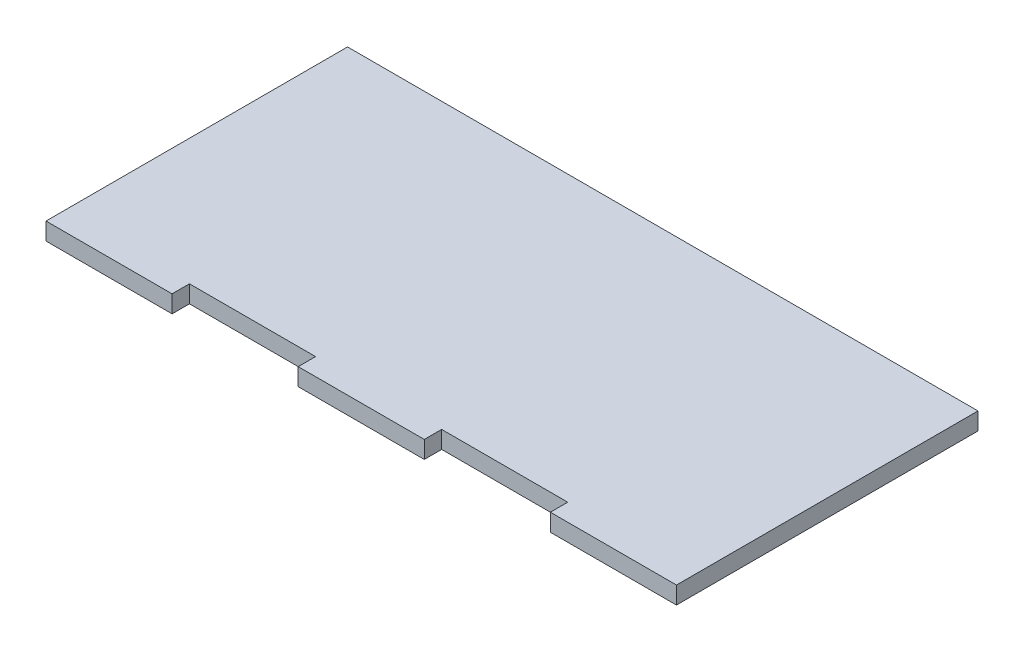
ISO-10303-21;
HEADER;
FILE_DESCRIPTION(('STEP AP214'),'2;1');
FILE_NAME('part.step','',(''),(''),'','','');
FILE_SCHEMA(('AUTOMOTIVE_DESIGN { 1 0 10303 214 1 1 1 1 }'));
ENDSEC;
DATA;
#1=APPLICATION_CONTEXT('core data for automotive mechanical design processes');
#2=APPLICATION_PROTOCOL_DEFINITION('international standard','automotive_design',2000,#1);
#3=PRODUCT_CONTEXT('',#1,'mechanical');
#4=PRODUCT('Part','Part','',(#3));
#5=PRODUCT_RELATED_PRODUCT_CATEGORY('part','',(#4));
#6=PRODUCT_DEFINITION_FORMATION('','',#4);
#7=PRODUCT_DEFINITION_CONTEXT('part definition',#1,'design');
#8=PRODUCT_DEFINITION('design','',#6,#7);
#9=PRODUCT_DEFINITION_SHAPE('','',#8);
#10=(LENGTH_UNIT() NAMED_UNIT(*) SI_UNIT(.MILLI.,.METRE.));
#11=(NAMED_UNIT(*) PLANE_ANGLE_UNIT() SI_UNIT($,.RADIAN.));
#12=(NAMED_UNIT(*) SI_UNIT($,.STERADIAN.) SOLID_ANGLE_UNIT());
#13=UNCERTAINTY_MEASURE_WITH_UNIT(LENGTH_MEASURE(1.E-05),#10,'distance_accuracy_value','');
#14=(GEOMETRIC_REPRESENTATION_CONTEXT(3) GLOBAL_UNCERTAINTY_ASSIGNED_CONTEXT((#13)) GLOBAL_UNIT_ASSIGNED_CONTEXT((#10,
#11,#12)) REPRESENTATION_CONTEXT('',''));
#15=CARTESIAN_POINT('',(0.,0.,0.));
#16=DIRECTION('',(0.,0.,1.));
#17=DIRECTION('',(1.,0.,0.));
#18=AXIS2_PLACEMENT_3D('',#15,#16,#17);
#19=CARTESIAN_POINT('',(-69.720993227991,9.7536,-3.44018058690745));
#20=DIRECTION('',(0.,0.,-1.));
#21=DIRECTION('',(-1.,0.,0.));
#22=AXIS2_PLACEMENT_3D('',#19,#20,#21);
#23=PLANE('',#22);
#24=DIRECTION('',(1.,0.,0.));
#25=VECTOR('',#24,1.);
#26=CARTESIAN_POINT('',(-69.720993227991,0.,-3.44018058690745));
#27=LINE('',#26,#25);
#28=CARTESIAN_POINT('',(-69.720993227991,0.,-3.44018058690745));
#29=VERTEX_POINT('',#28);
#30=CARTESIAN_POINT('',(1.07998277200905,0.,-3.44018058690745));
#31=VERTEX_POINT('',#30);
#32=EDGE_CURVE('E196',#29,#31,#27,.T.);
#33=ORIENTED_EDGE('',*,*,#32,.T.);
#34=DIRECTION('',(0.,-1.,0.));
#35=VECTOR('',#34,1.);
#36=CARTESIAN_POINT('',(1.07998277200905,9.7536,-3.44018058690745));
#37=LINE('',#36,#35);
#38=CARTESIAN_POINT('',(1.07998277200905,9.7536,-3.44018058690745));
#39=VERTEX_POINT('',#38);
#40=EDGE_CURVE('E152',#39,#31,#37,.T.);
#41=ORIENTED_EDGE('',*,*,#40,.F.);
#42=DIRECTION('',(1.,0.,0.));
#43=VECTOR('',#42,1.);
#44=CARTESIAN_POINT('',(-69.720993227991,9.7536,-3.44018058690745));
#45=LINE('',#44,#43);
#46=CARTESIAN_POINT('',(-69.720993227991,9.7536,-3.44018058690745));
#47=VERTEX_POINT('',#46);
#48=EDGE_CURVE('E142',#47,#39,#45,.T.);
#49=ORIENTED_EDGE('',*,*,#48,.F.);
#50=DIRECTION('',(0.,-1.,0.));
#51=VECTOR('',#50,1.);
#52=CARTESIAN_POINT('',(-69.720993227991,9.7536,-3.44018058690745));
#53=LINE('',#52,#51);
#54=EDGE_CURVE('E11',#47,#29,#53,.T.);
#55=ORIENTED_EDGE('',*,*,#54,.T.);
#56=EDGE_LOOP('',(#33,#41,#49,#55));
#57=FACE_BOUND('',#56,.T.);
#58=ADVANCED_FACE('F33',(#57),#23,.F.);
#59=CARTESIAN_POINT('',(213.482910772009,9.7536,-3.44018058690743));
#60=VERTEX_POINT('',#59);
#61=CARTESIAN_POINT('',(284.283886772009,9.7536,-3.44018058690745));
#62=VERTEX_POINT('',#61);
#63=EDGE_CURVE('E184',#60,#62,#45,.T.);
#64=ORIENTED_EDGE('',*,*,#63,.F.);
#65=DIRECTION('',(0.,-1.,0.));
#66=VECTOR('',#65,1.);
#67=CARTESIAN_POINT('',(213.482910772009,9.7536,-3.44018058690743));
#68=LINE('',#67,#66);
#69=CARTESIAN_POINT('',(213.482910772009,0.,-3.44018058690743));
#70=VERTEX_POINT('',#69);
#71=EDGE_CURVE('E169',#60,#70,#68,.T.);
#72=ORIENTED_EDGE('',*,*,#71,.T.);
#73=CARTESIAN_POINT('',(284.283886772009,0.,-3.44018058690745));
#74=VERTEX_POINT('',#73);
#75=EDGE_CURVE('E195',#70,#74,#27,.T.);
#76=ORIENTED_EDGE('',*,*,#75,.T.);
#77=DIRECTION('',(0.,-1.,0.));
#78=VECTOR('',#77,1.);
#79=CARTESIAN_POINT('',(284.283886772009,9.7536,-3.44018058690745));
#80=LINE('',#79,#78);
#81=EDGE_CURVE('E41',#62,#74,#80,.T.);
#82=ORIENTED_EDGE('',*,*,#81,.F.);
#83=EDGE_LOOP('',(#64,#72,#76,#82));
#84=FACE_BOUND('',#83,.T.);
#85=ADVANCED_FACE('F237',(#84),#23,.F.);
#86=CARTESIAN_POINT('',(-69.720993227991,9.7536,-172.756580586907));
#87=DIRECTION('',(1.,0.,0.));
#88=DIRECTION('',(0.,0.,-1.));
#89=AXIS2_PLACEMENT_3D('',#86,#87,#88);
#90=PLANE('',#89);
#91=DIRECTION('',(0.,0.,1.));
#92=VECTOR('',#91,1.);
#93=CARTESIAN_POINT('',(-69.720993227991,0.,-172.756580586907));
#94=LINE('',#93,#92);
#95=CARTESIAN_POINT('',(-69.720993227991,0.,-172.756580586907));
#96=VERTEX_POINT('',#95);
#97=EDGE_CURVE('E154',#96,#29,#94,.T.);
#98=ORIENTED_EDGE('',*,*,#97,.T.);
#99=ORIENTED_EDGE('',*,*,#54,.F.);
#100=DIRECTION('',(0.,0.,1.));
#101=VECTOR('',#100,1.);
#102=CARTESIAN_POINT('',(-69.720993227991,9.7536,-172.756580586907));
#103=LINE('',#102,#101);
#104=CARTESIAN_POINT('',(-69.720993227991,9.7536,-172.756580586907));
#105=VERTEX_POINT('',#104);
#106=EDGE_CURVE('E182',#105,#47,#103,.T.);
#107=ORIENTED_EDGE('',*,*,#106,.F.);
#108=DIRECTION('',(0.,-1.,0.));
#109=VECTOR('',#108,1.);
#110=CARTESIAN_POINT('',(-69.720993227991,9.7536,-172.756580586907));
#111=LINE('',#110,#109);
#112=EDGE_CURVE('E192',#105,#96,#111,.T.);
#113=ORIENTED_EDGE('',*,*,#112,.T.);
#114=EDGE_LOOP('',(#98,#99,#107,#113));
#115=FACE_BOUND('',#114,.T.);
#116=ADVANCED_FACE('F35',(#115),#90,.F.);
#117=CARTESIAN_POINT('',(71.880958772009,9.7536,-3.44018058690745));
#118=VERTEX_POINT('',#117);
#119=CARTESIAN_POINT('',(142.681934772009,9.7536,-3.44018058690745));
#120=VERTEX_POINT('',#119);
#121=EDGE_CURVE('E188',#118,#120,#45,.T.);
#122=ORIENTED_EDGE('',*,*,#121,.F.);
#123=DIRECTION('',(0.,-1.,0.));
#124=VECTOR('',#123,1.);
#125=CARTESIAN_POINT('',(71.880958772009,9.7536,-3.44018058690745));
#126=LINE('',#125,#124);
#127=CARTESIAN_POINT('',(71.880958772009,0.,-3.44018058690745));
#128=VERTEX_POINT('',#127);
#129=EDGE_CURVE('E155',#118,#128,#126,.T.);
#130=ORIENTED_EDGE('',*,*,#129,.T.);
#131=CARTESIAN_POINT('',(142.681934772009,0.,-3.44018058690745));
#132=VERTEX_POINT('',#131);
#133=EDGE_CURVE('E200',#128,#132,#27,.T.);
#134=ORIENTED_EDGE('',*,*,#133,.T.);
#135=DIRECTION('',(0.,-1.,0.));
#136=VECTOR('',#135,1.);
#137=CARTESIAN_POINT('',(142.681934772009,9.7536,-3.44018058690745));
#138=LINE('',#137,#136);
#139=EDGE_CURVE('E56',#120,#132,#138,.T.);
#140=ORIENTED_EDGE('',*,*,#139,.F.);
#141=EDGE_LOOP('',(#122,#130,#134,#140));
#142=FACE_BOUND('',#141,.T.);
#143=ADVANCED_FACE('F233',(#142),#23,.F.);
#144=CARTESIAN_POINT('',(284.283886772009,9.7536,-172.756580586907));
#145=DIRECTION('',(-1.,0.,0.));
#146=DIRECTION('',(0.,0.,1.));
#147=AXIS2_PLACEMENT_3D('',#144,#145,#146);
#148=PLANE('',#147);
#149=DIRECTION('',(0.,0.,-1.));
#150=VECTOR('',#149,1.);
#151=CARTESIAN_POINT('',(284.283886772009,0.,-172.756580586907));
#152=LINE('',#151,#150);
#153=CARTESIAN_POINT('',(284.283886772009,0.,-172.756580586907));
#154=VERTEX_POINT('',#153);
#155=EDGE_CURVE('E199',#74,#154,#152,.T.);
#156=ORIENTED_EDGE('',*,*,#155,.T.);
#157=DIRECTION('',(0.,-1.,0.));
#158=VECTOR('',#157,1.);
#159=CARTESIAN_POINT('',(284.283886772009,9.7536,-172.756580586907));
#160=LINE('',#159,#158);
#161=CARTESIAN_POINT('',(284.283886772009,9.7536,-172.756580586907));
#162=VERTEX_POINT('',#161);
#163=EDGE_CURVE('E205',#162,#154,#160,.T.);
#164=ORIENTED_EDGE('',*,*,#163,.F.);
#165=DIRECTION('',(0.,0.,-1.));
#166=VECTOR('',#165,1.);
#167=CARTESIAN_POINT('',(284.283886772009,9.7536,-172.756580586907));
#168=LINE('',#167,#166);
#169=EDGE_CURVE('E187',#62,#162,#168,.T.);
#170=ORIENTED_EDGE('',*,*,#169,.F.);
#171=ORIENTED_EDGE('',*,*,#81,.T.);
#172=EDGE_LOOP('',(#156,#164,#170,#171));
#173=FACE_BOUND('',#172,.T.);
#174=ADVANCED_FACE('F212',(#173),#148,.F.);
#175=CARTESIAN_POINT('',(-69.720993227991,9.7536,-172.756580586907));
#176=DIRECTION('',(0.,0.,1.));
#177=DIRECTION('',(1.,0.,0.));
#178=AXIS2_PLACEMENT_3D('',#175,#176,#177);
#179=PLANE('',#178);
#180=DIRECTION('',(-1.,0.,0.));
#181=VECTOR('',#180,1.);
#182=CARTESIAN_POINT('',(-69.720993227991,0.,-172.756580586907));
#183=LINE('',#182,#181);
#184=EDGE_CURVE('E185',#154,#96,#183,.T.);
#185=ORIENTED_EDGE('',*,*,#184,.T.);
#186=ORIENTED_EDGE('',*,*,#112,.F.);
#187=DIRECTION('',(-1.,0.,0.));
#188=VECTOR('',#187,1.);
#189=CARTESIAN_POINT('',(-69.720993227991,9.7536,-172.756580586907));
#190=LINE('',#189,#188);
#191=EDGE_CURVE('E190',#162,#105,#190,.T.);
#192=ORIENTED_EDGE('',*,*,#191,.F.);
#193=ORIENTED_EDGE('',*,*,#163,.T.);
#194=EDGE_LOOP('',(#185,#186,#192,#193));
#195=FACE_BOUND('',#194,.T.);
#196=ADVANCED_FACE('F224',(#195),#179,.F.);
#197=CARTESIAN_POINT('',(0.,9.7536,0.));
#198=DIRECTION('',(0.,1.,0.));
#199=DIRECTION('',(0.,0.,1.));
#200=AXIS2_PLACEMENT_3D('',#197,#198,#199);
#201=PLANE('',#200);
#202=DIRECTION('',(0.,0.,-1.));
#203=VECTOR('',#202,1.);
#204=CARTESIAN_POINT('',(1.07998277200905,9.7536,-3.44018058690745));
#205=LINE('',#204,#203);
#206=CARTESIAN_POINT('',(1.07998277200903,9.7536,-13.1937805869075));
#207=VERTEX_POINT('',#206);
#208=EDGE_CURVE('E124',#39,#207,#205,.T.);
#209=ORIENTED_EDGE('',*,*,#208,.T.);
#210=DIRECTION('',(1.,0.,0.));
#211=VECTOR('',#210,1.);
#212=CARTESIAN_POINT('',(1.07998277200903,9.7536,-13.1937805869075));
#213=LINE('',#212,#211);
#214=CARTESIAN_POINT('',(71.880958772009,9.7536,-13.1937805869075));
#215=VERTEX_POINT('',#214);
#216=EDGE_CURVE('E133',#207,#215,#213,.T.);
#217=ORIENTED_EDGE('',*,*,#216,.T.);
#218=DIRECTION('',(0.,0.,1.));
#219=VECTOR('',#218,1.);
#220=CARTESIAN_POINT('',(71.880958772009,9.7536,-3.44018058690745));
#221=LINE('',#220,#219);
#222=EDGE_CURVE('E130',#215,#118,#221,.T.);
#223=ORIENTED_EDGE('',*,*,#222,.T.);
#224=ORIENTED_EDGE('',*,*,#121,.T.);
#225=DIRECTION('',(0.,0.,-1.));
#226=VECTOR('',#225,1.);
#227=CARTESIAN_POINT('',(142.681934772009,9.7536,-3.44018058690745));
#228=LINE('',#227,#226);
#229=CARTESIAN_POINT('',(142.681934772009,9.7536,-13.1937805869075));
#230=VERTEX_POINT('',#229);
#231=EDGE_CURVE('E162',#120,#230,#228,.T.);
#232=ORIENTED_EDGE('',*,*,#231,.T.);
#233=DIRECTION('',(1.,0.,0.));
#234=VECTOR('',#233,1.);
#235=CARTESIAN_POINT('',(213.482910772009,9.7536,-13.1937805869074));
#236=LINE('',#235,#234);
#237=CARTESIAN_POINT('',(213.482910772009,9.7536,-13.1937805869074));
#238=VERTEX_POINT('',#237);
#239=EDGE_CURVE('E166',#230,#238,#236,.T.);
#240=ORIENTED_EDGE('',*,*,#239,.T.);
#241=DIRECTION('',(0.,0.,1.));
#242=VECTOR('',#241,1.);
#243=CARTESIAN_POINT('',(213.482910772009,9.7536,-3.44018058690743));
#244=LINE('',#243,#242);
#245=EDGE_CURVE('E159',#238,#60,#244,.T.);
#246=ORIENTED_EDGE('',*,*,#245,.T.);
#247=ORIENTED_EDGE('',*,*,#63,.T.);
#248=ORIENTED_EDGE('',*,*,#169,.T.);
#249=ORIENTED_EDGE('',*,*,#191,.T.);
#250=ORIENTED_EDGE('',*,*,#106,.T.);
#251=ORIENTED_EDGE('',*,*,#48,.T.);
#252=EDGE_LOOP('',(#209,#217,#223,#224,#232,#240,#246,#247,#248,#249,#250,#251));
#253=FACE_BOUND('',#252,.T.);
#254=ADVANCED_FACE('F140',(#253),#201,.T.);
#255=CARTESIAN_POINT('',(0.,0.,0.));
#256=DIRECTION('',(0.,1.,0.));
#257=DIRECTION('',(0.,0.,1.));
#258=AXIS2_PLACEMENT_3D('',#255,#256,#257);
#259=PLANE('',#258);
#260=DIRECTION('',(1.,0.,0.));
#261=VECTOR('',#260,1.);
#262=CARTESIAN_POINT('',(1.07998277200903,0.,-13.1937805869075));
#263=LINE('',#262,#261);
#264=CARTESIAN_POINT('',(1.07998277200903,0.,-13.1937805869075));
#265=VERTEX_POINT('',#264);
#266=CARTESIAN_POINT('',(71.880958772009,0.,-13.1937805869075));
#267=VERTEX_POINT('',#266);
#268=EDGE_CURVE('E145',#265,#267,#263,.T.);
#269=ORIENTED_EDGE('',*,*,#268,.F.);
#270=DIRECTION('',(0.,0.,-1.));
#271=VECTOR('',#270,1.);
#272=CARTESIAN_POINT('',(1.07998277200905,0.,-3.44018058690745));
#273=LINE('',#272,#271);
#274=EDGE_CURVE('E48',#31,#265,#273,.T.);
#275=ORIENTED_EDGE('',*,*,#274,.F.);
#276=ORIENTED_EDGE('',*,*,#32,.F.);
#277=ORIENTED_EDGE('',*,*,#97,.F.);
#278=ORIENTED_EDGE('',*,*,#184,.F.);
#279=ORIENTED_EDGE('',*,*,#155,.F.);
#280=ORIENTED_EDGE('',*,*,#75,.F.);
#281=DIRECTION('',(0.,0.,1.));
#282=VECTOR('',#281,1.);
#283=CARTESIAN_POINT('',(213.482910772009,0.,-3.44018058690743));
#284=LINE('',#283,#282);
#285=CARTESIAN_POINT('',(213.482910772009,0.,-13.1937805869074));
#286=VERTEX_POINT('',#285);
#287=EDGE_CURVE('E170',#286,#70,#284,.T.);
#288=ORIENTED_EDGE('',*,*,#287,.F.);
#289=DIRECTION('',(1.,0.,0.));
#290=VECTOR('',#289,1.);
#291=CARTESIAN_POINT('',(213.482910772009,0.,-13.1937805869074));
#292=LINE('',#291,#290);
#293=CARTESIAN_POINT('',(142.681934772009,0.,-13.1937805869075));
#294=VERTEX_POINT('',#293);
#295=EDGE_CURVE('E163',#294,#286,#292,.T.);
#296=ORIENTED_EDGE('',*,*,#295,.F.);
#297=DIRECTION('',(0.,0.,-1.));
#298=VECTOR('',#297,1.);
#299=CARTESIAN_POINT('',(142.681934772009,0.,-3.44018058690745));
#300=LINE('',#299,#298);
#301=EDGE_CURVE('E172',#132,#294,#300,.T.);
#302=ORIENTED_EDGE('',*,*,#301,.F.);
#303=ORIENTED_EDGE('',*,*,#133,.F.);
#304=DIRECTION('',(0.,0.,1.));
#305=VECTOR('',#304,1.);
#306=CARTESIAN_POINT('',(71.880958772009,0.,-3.44018058690745));
#307=LINE('',#306,#305);
#308=EDGE_CURVE('E143',#267,#128,#307,.T.);
#309=ORIENTED_EDGE('',*,*,#308,.F.);
#310=EDGE_LOOP('',(#269,#275,#276,#277,#278,#279,#280,#288,#296,#302,#303,#309));
#311=FACE_BOUND('',#310,.T.);
#312=ADVANCED_FACE('F219',(#311),#259,.F.);
#313=CARTESIAN_POINT('',(213.482910772009,9.7536,-3.44018058690743));
#314=DIRECTION('',(1.,0.,0.));
#315=DIRECTION('',(0.,0.,-1.));
#316=AXIS2_PLACEMENT_3D('',#313,#314,#315);
#317=PLANE('',#316);
#318=ORIENTED_EDGE('',*,*,#287,.T.);
#319=ORIENTED_EDGE('',*,*,#71,.F.);
#320=ORIENTED_EDGE('',*,*,#245,.F.);
#321=DIRECTION('',(0.,-1.,0.));
#322=VECTOR('',#321,1.);
#323=CARTESIAN_POINT('',(213.482910772009,9.7536,-13.1937805869074));
#324=LINE('',#323,#322);
#325=EDGE_CURVE('E150',#238,#286,#324,.T.);
#326=ORIENTED_EDGE('',*,*,#325,.T.);
#327=EDGE_LOOP('',(#318,#319,#320,#326));
#328=FACE_BOUND('',#327,.T.);
#329=ADVANCED_FACE('F239',(#328),#317,.F.);
#330=CARTESIAN_POINT('',(213.482910772009,9.7536,-13.1937805869074));
#331=DIRECTION('',(0.,0.,-1.));
#332=DIRECTION('',(-1.,0.,0.));
#333=AXIS2_PLACEMENT_3D('',#330,#331,#332);
#334=PLANE('',#333);
#335=ORIENTED_EDGE('',*,*,#295,.T.);
#336=ORIENTED_EDGE('',*,*,#325,.F.);
#337=ORIENTED_EDGE('',*,*,#239,.F.);
#338=DIRECTION('',(0.,-1.,0.));
#339=VECTOR('',#338,1.);
#340=CARTESIAN_POINT('',(142.681934772009,9.7536,-13.1937805869075));
#341=LINE('',#340,#339);
#342=EDGE_CURVE('E177',#230,#294,#341,.T.);
#343=ORIENTED_EDGE('',*,*,#342,.T.);
#344=EDGE_LOOP('',(#335,#336,#337,#343));
#345=FACE_BOUND('',#344,.T.);
#346=ADVANCED_FACE('F242',(#345),#334,.F.);
#347=CARTESIAN_POINT('',(142.681934772009,9.7536,-3.44018058690745));
#348=DIRECTION('',(-1.,0.,0.));
#349=DIRECTION('',(0.,0.,1.));
#350=AXIS2_PLACEMENT_3D('',#347,#348,#349);
#351=PLANE('',#350);
#352=ORIENTED_EDGE('',*,*,#301,.T.);
#353=ORIENTED_EDGE('',*,*,#342,.F.);
#354=ORIENTED_EDGE('',*,*,#231,.F.);
#355=ORIENTED_EDGE('',*,*,#139,.T.);
#356=EDGE_LOOP('',(#352,#353,#354,#355));
#357=FACE_BOUND('',#356,.T.);
#358=ADVANCED_FACE('F244',(#357),#351,.F.);
#359=CARTESIAN_POINT('',(1.07998277200905,9.7536,-3.44018058690745));
#360=DIRECTION('',(-1.,0.,0.));
#361=DIRECTION('',(0.,0.,1.));
#362=AXIS2_PLACEMENT_3D('',#359,#360,#361);
#363=PLANE('',#362);
#364=ORIENTED_EDGE('',*,*,#274,.T.);
#365=DIRECTION('',(0.,-1.,0.));
#366=VECTOR('',#365,1.);
#367=CARTESIAN_POINT('',(1.07998277200903,9.7536,-13.1937805869075));
#368=LINE('',#367,#366);
#369=EDGE_CURVE('E120',#207,#265,#368,.T.);
#370=ORIENTED_EDGE('',*,*,#369,.F.);
#371=ORIENTED_EDGE('',*,*,#208,.F.);
#372=ORIENTED_EDGE('',*,*,#40,.T.);
#373=EDGE_LOOP('',(#364,#370,#371,#372));
#374=FACE_BOUND('',#373,.T.);
#375=ADVANCED_FACE('F122',(#374),#363,.F.);
#376=CARTESIAN_POINT('',(71.880958772009,9.7536,-3.44018058690745));
#377=DIRECTION('',(1.,0.,0.));
#378=DIRECTION('',(0.,0.,-1.));
#379=AXIS2_PLACEMENT_3D('',#376,#377,#378);
#380=PLANE('',#379);
#381=ORIENTED_EDGE('',*,*,#308,.T.);
#382=ORIENTED_EDGE('',*,*,#129,.F.);
#383=ORIENTED_EDGE('',*,*,#222,.F.);
#384=DIRECTION('',(0.,-1.,0.));
#385=VECTOR('',#384,1.);
#386=CARTESIAN_POINT('',(71.880958772009,9.7536,-13.1937805869075));
#387=LINE('',#386,#385);
#388=EDGE_CURVE('E129',#215,#267,#387,.T.);
#389=ORIENTED_EDGE('',*,*,#388,.T.);
#390=EDGE_LOOP('',(#381,#382,#383,#389));
#391=FACE_BOUND('',#390,.T.);
#392=ADVANCED_FACE('F251',(#391),#380,.F.);
#393=CARTESIAN_POINT('',(1.07998277200903,9.7536,-13.1937805869075));
#394=DIRECTION('',(0.,0.,-1.));
#395=DIRECTION('',(-1.,0.,0.));
#396=AXIS2_PLACEMENT_3D('',#393,#394,#395);
#397=PLANE('',#396);
#398=ORIENTED_EDGE('',*,*,#268,.T.);
#399=ORIENTED_EDGE('',*,*,#388,.F.);
#400=ORIENTED_EDGE('',*,*,#216,.F.);
#401=ORIENTED_EDGE('',*,*,#369,.T.);
#402=EDGE_LOOP('',(#398,#399,#400,#401));
#403=FACE_BOUND('',#402,.T.);
#404=ADVANCED_FACE('F134',(#403),#397,.F.);
#405=CLOSED_SHELL('',(#58,#85,#116,#143,#174,#196,#254,#312,#329,#346,#358,#375,#392,#404));
#406=MANIFOLD_SOLID_BREP('B2',#405);
#407=ADVANCED_BREP_SHAPE_REPRESENTATION('',(#18,#406),#14);
#408=SHAPE_DEFINITION_REPRESENTATION(#9,#407);
ENDSEC;
END-ISO-10303-21;
